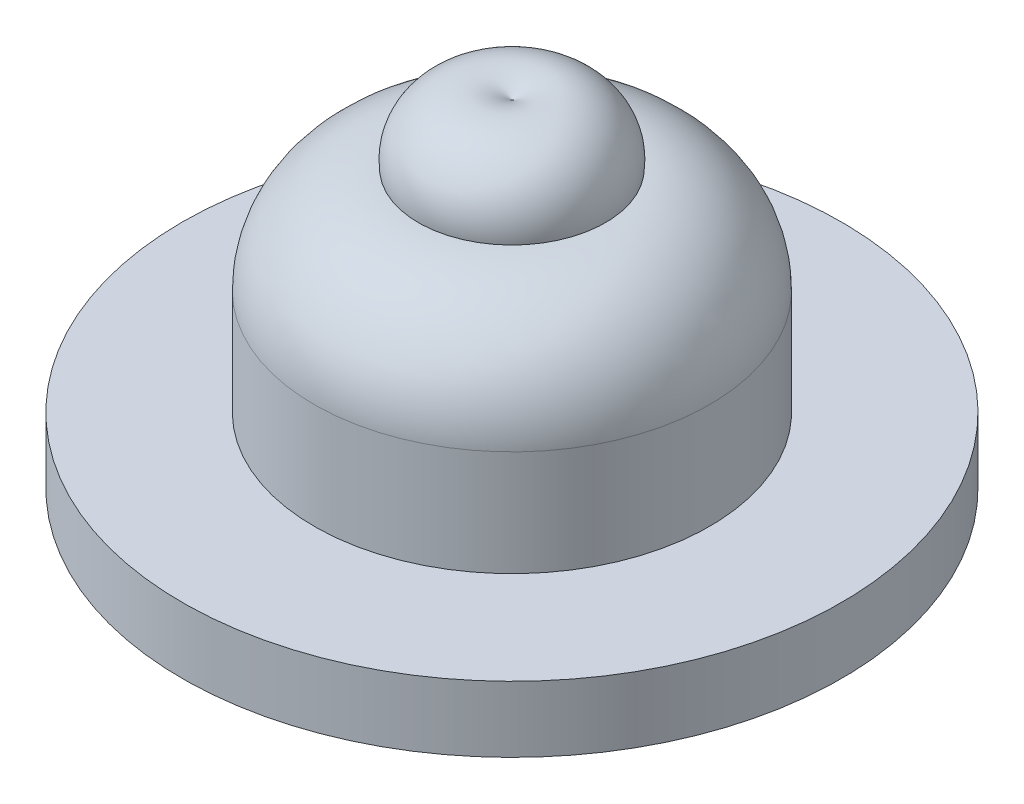
ISO-10303-21;
HEADER;
FILE_DESCRIPTION(('STEP AP214'),'2;1');
FILE_NAME('part.step','',(''),(''),'','','');
FILE_SCHEMA(('AUTOMOTIVE_DESIGN { 1 0 10303 214 1 1 1 1 }'));
ENDSEC;
DATA;
#1=APPLICATION_CONTEXT('core data for automotive mechanical design processes');
#2=APPLICATION_PROTOCOL_DEFINITION('international standard','automotive_design',2000,#1);
#3=PRODUCT_CONTEXT('',#1,'mechanical');
#4=PRODUCT('Part','Part','',(#3));
#5=PRODUCT_RELATED_PRODUCT_CATEGORY('part','',(#4));
#6=PRODUCT_DEFINITION_FORMATION('','',#4);
#7=PRODUCT_DEFINITION_CONTEXT('part definition',#1,'design');
#8=PRODUCT_DEFINITION('design','',#6,#7);
#9=PRODUCT_DEFINITION_SHAPE('','',#8);
#10=(LENGTH_UNIT() NAMED_UNIT(*) SI_UNIT(.MILLI.,.METRE.));
#11=(NAMED_UNIT(*) PLANE_ANGLE_UNIT() SI_UNIT($,.RADIAN.));
#12=(NAMED_UNIT(*) SI_UNIT($,.STERADIAN.) SOLID_ANGLE_UNIT());
#13=UNCERTAINTY_MEASURE_WITH_UNIT(LENGTH_MEASURE(1.E-05),#10,'distance_accuracy_value','');
#14=(GEOMETRIC_REPRESENTATION_CONTEXT(3) GLOBAL_UNCERTAINTY_ASSIGNED_CONTEXT((#13)) GLOBAL_UNIT_ASSIGNED_CONTEXT((#10,
#11,#12)) REPRESENTATION_CONTEXT('',''));
#15=CARTESIAN_POINT('',(0.,0.,0.));
#16=DIRECTION('',(0.,0.,1.));
#17=DIRECTION('',(1.,0.,0.));
#18=AXIS2_PLACEMENT_3D('',#15,#16,#17);
#19=CARTESIAN_POINT('',(0.,3.99602970845645,0.));
#20=DIRECTION('',(0.,-1.,0.));
#21=DIRECTION('',(1.,0.,0.));
#22=AXIS2_PLACEMENT_3D('',#19,#20,#21);
#23=PLANE('',#22);
#24=CARTESIAN_POINT('',(0.,3.99602970845645,0.));
#25=DIRECTION('',(0.,1.,0.));
#26=DIRECTION('',(-1.,0.,0.));
#27=AXIS2_PLACEMENT_3D('',#24,#25,#26);
#28=CIRCLE('',#27,12.5);
#29=CARTESIAN_POINT('',(-12.5,3.99602970845645,0.));
#30=VERTEX_POINT('',#29);
#31=EDGE_CURVE('E11',#30,#30,#28,.T.);
#32=ORIENTED_EDGE('',*,*,#31,.F.);
#33=EDGE_LOOP('',(#32));
#34=FACE_BOUND('',#33,.T.);
#35=ADVANCED_FACE('F41',(#34),#23,.T.);
#36=CARTESIAN_POINT('',(0.,16.7460297084564,0.));
#37=DIRECTION('',(0.,1.,0.));
#38=DIRECTION('',(-1.,0.,0.));
#39=AXIS2_PLACEMENT_3D('',#36,#37,#38);
#40=CYLINDRICAL_SURFACE('',#39,12.5);
#41=CARTESIAN_POINT('',(0.,6.49602970845645,0.));
#42=DIRECTION('',(0.,1.,0.));
#43=DIRECTION('',(-1.,0.,0.));
#44=AXIS2_PLACEMENT_3D('',#41,#42,#43);
#45=CIRCLE('',#44,12.5);
#46=CARTESIAN_POINT('',(-12.5,6.49602970845645,0.));
#47=VERTEX_POINT('',#46);
#48=EDGE_CURVE('E48',#47,#47,#45,.T.);
#49=ORIENTED_EDGE('',*,*,#48,.F.);
#50=EDGE_LOOP('',(#49));
#51=FACE_BOUND('',#50,.T.);
#52=ORIENTED_EDGE('',*,*,#31,.T.);
#53=EDGE_LOOP('',(#52));
#54=FACE_BOUND('',#53,.T.);
#55=ADVANCED_FACE('F76',(#51,#54),#40,.T.);
#56=CARTESIAN_POINT('',(0.,6.49602970845645,0.));
#57=DIRECTION('',(0.,-1.,0.));
#58=DIRECTION('',(1.,0.,0.));
#59=AXIS2_PLACEMENT_3D('',#56,#57,#58);
#60=PLANE('',#59);
#61=CARTESIAN_POINT('',(0.,6.49602970845645,0.));
#62=DIRECTION('',(0.,1.,0.));
#63=DIRECTION('',(-1.,0.,0.));
#64=AXIS2_PLACEMENT_3D('',#61,#62,#63);
#65=CIRCLE('',#64,7.5);
#66=CARTESIAN_POINT('',(-7.5,6.49602970845645,0.));
#67=VERTEX_POINT('',#66);
#68=EDGE_CURVE('E65',#67,#67,#65,.T.);
#69=ORIENTED_EDGE('',*,*,#68,.F.);
#70=EDGE_LOOP('',(#69));
#71=FACE_BOUND('',#70,.T.);
#72=ORIENTED_EDGE('',*,*,#48,.T.);
#73=EDGE_LOOP('',(#72));
#74=FACE_BOUND('',#73,.T.);
#75=ADVANCED_FACE('F74',(#71,#74),#60,.F.);
#76=CARTESIAN_POINT('',(0.,16.7460297084564,0.));
#77=DIRECTION('',(0.,1.,0.));
#78=DIRECTION('',(-1.,0.,0.));
#79=AXIS2_PLACEMENT_3D('',#76,#77,#78);
#80=CYLINDRICAL_SURFACE('',#79,7.5);
#81=CARTESIAN_POINT('',(0.,10.4960297084565,0.));
#82=DIRECTION('',(0.,1.,0.));
#83=DIRECTION('',(-1.,0.,0.));
#84=AXIS2_PLACEMENT_3D('',#81,#82,#83);
#85=CIRCLE('',#84,7.5);
#86=CARTESIAN_POINT('',(-7.5,10.4960297084565,0.));
#87=VERTEX_POINT('',#86);
#88=EDGE_CURVE('E61',#87,#87,#85,.T.);
#89=ORIENTED_EDGE('',*,*,#88,.F.);
#90=EDGE_LOOP('',(#89));
#91=FACE_BOUND('',#90,.T.);
#92=ORIENTED_EDGE('',*,*,#68,.T.);
#93=EDGE_LOOP('',(#92));
#94=FACE_BOUND('',#93,.T.);
#95=ADVANCED_FACE('F94',(#91,#94),#80,.T.);
#96=CARTESIAN_POINT('',(0.,10.4960297084565,0.));
#97=DIRECTION('',(0.,1.,0.));
#98=DIRECTION('',(-1.,0.,0.));
#99=AXIS2_PLACEMENT_3D('',#96,#97,#98);
#100=DEGENERATE_TOROIDAL_SURFACE('',#99,3.5,4.,.T.);
#101=CARTESIAN_POINT('',(0.,14.4957279515211,0.));
#102=DIRECTION('',(0.,1.,0.));
#103=DIRECTION('',(-1.,0.,0.));
#104=AXIS2_PLACEMENT_3D('',#101,#102,#103);
#105=CIRCLE('',#104,3.54913211195717);
#106=CARTESIAN_POINT('',(-3.54913211195717,14.4957279515211,0.));
#107=VERTEX_POINT('',#106);
#108=EDGE_CURVE('E58',#107,#107,#105,.T.);
#109=ORIENTED_EDGE('',*,*,#108,.F.);
#110=EDGE_LOOP('',(#109));
#111=FACE_BOUND('',#110,.T.);
#112=ORIENTED_EDGE('',*,*,#88,.T.);
#113=EDGE_LOOP('',(#112));
#114=FACE_BOUND('',#113,.T.);
#115=ADVANCED_FACE('F54',(#111,#114),#100,.T.);
#116=CARTESIAN_POINT('',(-1.24397994976672,14.7840487551283,0.));
#117=DIRECTION('',(0.,0.,-1.));
#118=DIRECTION('',(-1.,0.,0.));
#119=AXIS2_PLACEMENT_3D('',#116,#117,#118);
#120=CIRCLE('',#119,2.32311329397513);
#121=TRIMMED_CURVE('',#120,(PARAMETER_VALUE(-2.13587193722863)),
(PARAMETER_VALUE(2.13587193722863)),.T.,.PARAMETER.);
#122=CARTESIAN_POINT('',(0.,14.7840487551283,0.));
#123=DIRECTION('',(0.,1.,0.));
#124=AXIS1_PLACEMENT('',#122,#123);
#125=SURFACE_OF_REVOLUTION('',#121,#124);
#126=CARTESIAN_POINT('',(0.,16.7460297084564,0.));
#127=VERTEX_POINT('',#126);
#128=VERTEX_LOOP('',#127);
#129=FACE_BOUND('',#128,.T.);
#130=ORIENTED_EDGE('',*,*,#108,.T.);
#131=EDGE_LOOP('',(#130));
#132=FACE_BOUND('',#131,.T.);
#133=ADVANCED_FACE('F51',(#129,#132),#125,.T.);
#134=CLOSED_SHELL('',(#35,#55,#75,#95,#115,#133));
#135=MANIFOLD_SOLID_BREP('B2',#134);
#136=ADVANCED_BREP_SHAPE_REPRESENTATION('',(#18,#135),#14);
#137=SHAPE_DEFINITION_REPRESENTATION(#9,#136);
ENDSEC;
END-ISO-10303-21;
